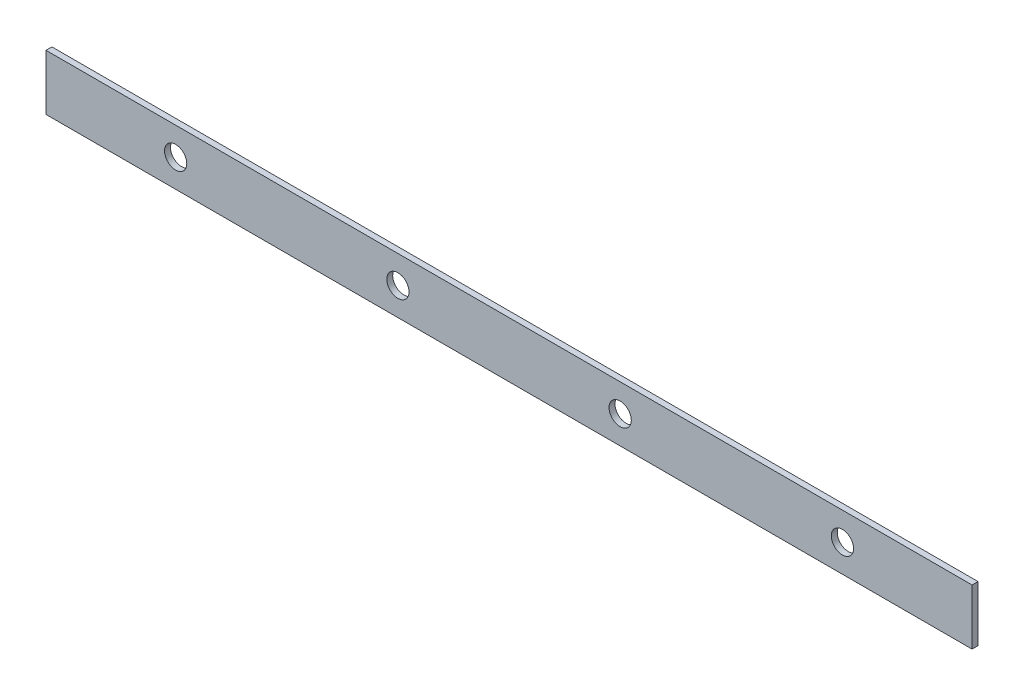
ISO-10303-21;
HEADER;
FILE_DESCRIPTION(('STEP AP214'),'2;1');
FILE_NAME('part.step','',(''),(''),'','','');
FILE_SCHEMA(('AUTOMOTIVE_DESIGN { 1 0 10303 214 1 1 1 1 }'));
ENDSEC;
DATA;
#1=APPLICATION_CONTEXT('core data for automotive mechanical design processes');
#2=APPLICATION_PROTOCOL_DEFINITION('international standard','automotive_design',2000,#1);
#3=PRODUCT_CONTEXT('',#1,'mechanical');
#4=PRODUCT('Part','Part','',(#3));
#5=PRODUCT_RELATED_PRODUCT_CATEGORY('part','',(#4));
#6=PRODUCT_DEFINITION_FORMATION('','',#4);
#7=PRODUCT_DEFINITION_CONTEXT('part definition',#1,'design');
#8=PRODUCT_DEFINITION('design','',#6,#7);
#9=PRODUCT_DEFINITION_SHAPE('','',#8);
#10=(LENGTH_UNIT() NAMED_UNIT(*) SI_UNIT(.MILLI.,.METRE.));
#11=(NAMED_UNIT(*) PLANE_ANGLE_UNIT() SI_UNIT($,.RADIAN.));
#12=(NAMED_UNIT(*) SI_UNIT($,.STERADIAN.) SOLID_ANGLE_UNIT());
#13=UNCERTAINTY_MEASURE_WITH_UNIT(LENGTH_MEASURE(1.E-05),#10,'distance_accuracy_value','');
#14=(GEOMETRIC_REPRESENTATION_CONTEXT(3) GLOBAL_UNCERTAINTY_ASSIGNED_CONTEXT((#13)) GLOBAL_UNIT_ASSIGNED_CONTEXT((#10,
#11,#12)) REPRESENTATION_CONTEXT('',''));
#15=CARTESIAN_POINT('',(0.,0.,0.));
#16=DIRECTION('',(0.,0.,1.));
#17=DIRECTION('',(1.,0.,0.));
#18=AXIS2_PLACEMENT_3D('',#15,#16,#17);
#19=CARTESIAN_POINT('',(0.,15.,-1.6));
#20=DIRECTION('',(-1.,0.,0.));
#21=DIRECTION('',(0.,-1.,0.));
#22=AXIS2_PLACEMENT_3D('',#19,#20,#21);
#23=PLANE('',#22);
#24=DIRECTION('',(0.,-1.,0.));
#25=VECTOR('',#24,1.);
#26=CARTESIAN_POINT('',(0.,15.,0.));
#27=LINE('',#26,#25);
#28=CARTESIAN_POINT('',(0.,15.,0.));
#29=VERTEX_POINT('',#28);
#30=CARTESIAN_POINT('',(0.,0.,0.));
#31=VERTEX_POINT('',#30);
#32=EDGE_CURVE('E102',#29,#31,#27,.T.);
#33=ORIENTED_EDGE('',*,*,#32,.F.);
#34=DIRECTION('',(0.,0.,1.));
#35=VECTOR('',#34,1.);
#36=CARTESIAN_POINT('',(0.,15.,-1.6));
#37=LINE('',#36,#35);
#38=CARTESIAN_POINT('',(0.,15.,-1.6));
#39=VERTEX_POINT('',#38);
#40=EDGE_CURVE('E11',#39,#29,#37,.T.);
#41=ORIENTED_EDGE('',*,*,#40,.F.);
#42=DIRECTION('',(0.,-1.,0.));
#43=VECTOR('',#42,1.);
#44=CARTESIAN_POINT('',(0.,15.,-1.6));
#45=LINE('',#44,#43);
#46=CARTESIAN_POINT('',(0.,0.,-1.6));
#47=VERTEX_POINT('',#46);
#48=EDGE_CURVE('E95',#39,#47,#45,.T.);
#49=ORIENTED_EDGE('',*,*,#48,.T.);
#50=DIRECTION('',(0.,0.,1.));
#51=VECTOR('',#50,1.);
#52=CARTESIAN_POINT('',(0.,0.,-1.6));
#53=LINE('',#52,#51);
#54=EDGE_CURVE('E40',#47,#31,#53,.T.);
#55=ORIENTED_EDGE('',*,*,#54,.T.);
#56=EDGE_LOOP('',(#33,#41,#49,#55));
#57=FACE_BOUND('',#56,.T.);
#58=ADVANCED_FACE('F37',(#57),#23,.T.);
#59=CARTESIAN_POINT('',(250.,15.,-1.6));
#60=DIRECTION('',(0.,1.,0.));
#61=DIRECTION('',(-1.,0.,0.));
#62=AXIS2_PLACEMENT_3D('',#59,#60,#61);
#63=PLANE('',#62);
#64=DIRECTION('',(-1.,0.,0.));
#65=VECTOR('',#64,1.);
#66=CARTESIAN_POINT('',(250.,15.,0.));
#67=LINE('',#66,#65);
#68=CARTESIAN_POINT('',(250.,15.,0.));
#69=VERTEX_POINT('',#68);
#70=EDGE_CURVE('E97',#69,#29,#67,.T.);
#71=ORIENTED_EDGE('',*,*,#70,.F.);
#72=DIRECTION('',(0.,0.,1.));
#73=VECTOR('',#72,1.);
#74=CARTESIAN_POINT('',(250.,15.,-1.6));
#75=LINE('',#74,#73);
#76=CARTESIAN_POINT('',(250.,15.,-1.6));
#77=VERTEX_POINT('',#76);
#78=EDGE_CURVE('E46',#77,#69,#75,.T.);
#79=ORIENTED_EDGE('',*,*,#78,.F.);
#80=DIRECTION('',(-1.,0.,0.));
#81=VECTOR('',#80,1.);
#82=CARTESIAN_POINT('',(250.,15.,-1.6));
#83=LINE('',#82,#81);
#84=EDGE_CURVE('E92',#77,#39,#83,.T.);
#85=ORIENTED_EDGE('',*,*,#84,.T.);
#86=ORIENTED_EDGE('',*,*,#40,.T.);
#87=EDGE_LOOP('',(#71,#79,#85,#86));
#88=FACE_BOUND('',#87,.T.);
#89=ADVANCED_FACE('F113',(#88),#63,.T.);
#90=CARTESIAN_POINT('',(250.,15.,-1.6));
#91=DIRECTION('',(1.,0.,0.));
#92=DIRECTION('',(0.,0.,-1.));
#93=AXIS2_PLACEMENT_3D('',#90,#91,#92);
#94=PLANE('',#93);
#95=DIRECTION('',(0.,1.,0.));
#96=VECTOR('',#95,1.);
#97=CARTESIAN_POINT('',(250.,15.,0.));
#98=LINE('',#97,#96);
#99=CARTESIAN_POINT('',(250.,0.,0.));
#100=VERTEX_POINT('',#99);
#101=EDGE_CURVE('E87',#100,#69,#98,.T.);
#102=ORIENTED_EDGE('',*,*,#101,.F.);
#103=DIRECTION('',(0.,0.,1.));
#104=VECTOR('',#103,1.);
#105=CARTESIAN_POINT('',(250.,0.,-1.6));
#106=LINE('',#105,#104);
#107=CARTESIAN_POINT('',(250.,0.,-1.6));
#108=VERTEX_POINT('',#107);
#109=EDGE_CURVE('E82',#108,#100,#106,.T.);
#110=ORIENTED_EDGE('',*,*,#109,.F.);
#111=DIRECTION('',(0.,1.,0.));
#112=VECTOR('',#111,1.);
#113=CARTESIAN_POINT('',(250.,15.,-1.6));
#114=LINE('',#113,#112);
#115=EDGE_CURVE('E85',#108,#77,#114,.T.);
#116=ORIENTED_EDGE('',*,*,#115,.T.);
#117=ORIENTED_EDGE('',*,*,#78,.T.);
#118=EDGE_LOOP('',(#102,#110,#116,#117));
#119=FACE_BOUND('',#118,.T.);
#120=ADVANCED_FACE('F84',(#119),#94,.T.);
#121=CARTESIAN_POINT('',(0.,0.,-1.6));
#122=DIRECTION('',(0.,-1.,0.));
#123=DIRECTION('',(1.,0.,0.));
#124=AXIS2_PLACEMENT_3D('',#121,#122,#123);
#125=PLANE('',#124);
#126=DIRECTION('',(1.,0.,0.));
#127=VECTOR('',#126,1.);
#128=CARTESIAN_POINT('',(0.,0.,0.));
#129=LINE('',#128,#127);
#130=EDGE_CURVE('E105',#31,#100,#129,.T.);
#131=ORIENTED_EDGE('',*,*,#130,.F.);
#132=ORIENTED_EDGE('',*,*,#54,.F.);
#133=DIRECTION('',(1.,0.,0.));
#134=VECTOR('',#133,1.);
#135=CARTESIAN_POINT('',(0.,0.,-1.6));
#136=LINE('',#135,#134);
#137=EDGE_CURVE('E91',#47,#108,#136,.T.);
#138=ORIENTED_EDGE('',*,*,#137,.T.);
#139=ORIENTED_EDGE('',*,*,#109,.T.);
#140=EDGE_LOOP('',(#131,#132,#138,#139));
#141=FACE_BOUND('',#140,.T.);
#142=ADVANCED_FACE('F94',(#141),#125,.T.);
#143=CARTESIAN_POINT('',(0.,0.,-1.6));
#144=DIRECTION('',(0.,0.,1.));
#145=DIRECTION('',(1.,0.,0.));
#146=AXIS2_PLACEMENT_3D('',#143,#144,#145);
#147=PLANE('',#146);
#148=CARTESIAN_POINT('',(155.,7.50000000000004,-1.6));
#149=DIRECTION('',(0.,0.,1.));
#150=DIRECTION('',(1.,0.,0.));
#151=AXIS2_PLACEMENT_3D('',#148,#149,#150);
#152=CIRCLE('',#151,2.99999999999999);
#153=CARTESIAN_POINT('',(158.,7.50000000000004,-1.6));
#154=VERTEX_POINT('',#153);
#155=EDGE_CURVE('E154',#154,#154,#152,.T.);
#156=ORIENTED_EDGE('',*,*,#155,.T.);
#157=EDGE_LOOP('',(#156));
#158=FACE_BOUND('',#157,.T.);
#159=CARTESIAN_POINT('',(35.,7.50000000000003,-1.6));
#160=DIRECTION('',(0.,0.,1.));
#161=DIRECTION('',(1.,0.,0.));
#162=AXIS2_PLACEMENT_3D('',#159,#160,#161);
#163=CIRCLE('',#162,3.);
#164=CARTESIAN_POINT('',(38.,7.50000000000003,-1.6));
#165=VERTEX_POINT('',#164);
#166=EDGE_CURVE('E162',#165,#165,#163,.T.);
#167=ORIENTED_EDGE('',*,*,#166,.T.);
#168=EDGE_LOOP('',(#167));
#169=FACE_BOUND('',#168,.T.);
#170=CARTESIAN_POINT('',(95.,7.50000000000003,-1.6));
#171=DIRECTION('',(0.,0.,1.));
#172=DIRECTION('',(1.,0.,0.));
#173=AXIS2_PLACEMENT_3D('',#170,#171,#172);
#174=CIRCLE('',#173,3.00000000000001);
#175=CARTESIAN_POINT('',(98.,7.50000000000003,-1.6));
#176=VERTEX_POINT('',#175);
#177=EDGE_CURVE('E168',#176,#176,#174,.T.);
#178=ORIENTED_EDGE('',*,*,#177,.T.);
#179=EDGE_LOOP('',(#178));
#180=FACE_BOUND('',#179,.T.);
#181=CARTESIAN_POINT('',(215.,7.50000000000006,-1.6));
#182=DIRECTION('',(0.,0.,1.));
#183=DIRECTION('',(1.,0.,0.));
#184=AXIS2_PLACEMENT_3D('',#181,#182,#183);
#185=CIRCLE('',#184,2.99999999999999);
#186=CARTESIAN_POINT('',(218.,7.50000000000006,-1.6));
#187=VERTEX_POINT('',#186);
#188=EDGE_CURVE('E106',#187,#187,#185,.T.);
#189=ORIENTED_EDGE('',*,*,#188,.T.);
#190=EDGE_LOOP('',(#189));
#191=FACE_BOUND('',#190,.T.);
#192=ORIENTED_EDGE('',*,*,#48,.F.);
#193=ORIENTED_EDGE('',*,*,#84,.F.);
#194=ORIENTED_EDGE('',*,*,#115,.F.);
#195=ORIENTED_EDGE('',*,*,#137,.F.);
#196=EDGE_LOOP('',(#192,#193,#194,#195));
#197=FACE_BOUND('',#196,.T.);
#198=ADVANCED_FACE('F90',(#158,#169,#180,#191,#197),#147,.F.);
#199=CARTESIAN_POINT('',(0.,0.,0.));
#200=DIRECTION('',(0.,0.,1.));
#201=DIRECTION('',(1.,0.,0.));
#202=AXIS2_PLACEMENT_3D('',#199,#200,#201);
#203=PLANE('',#202);
#204=CARTESIAN_POINT('',(155.,7.50000000000004,0.));
#205=DIRECTION('',(0.,0.,1.));
#206=DIRECTION('',(1.,0.,0.));
#207=AXIS2_PLACEMENT_3D('',#204,#205,#206);
#208=CIRCLE('',#207,2.99999999999999);
#209=CARTESIAN_POINT('',(158.,7.50000000000004,0.));
#210=VERTEX_POINT('',#209);
#211=EDGE_CURVE('E157',#210,#210,#208,.T.);
#212=ORIENTED_EDGE('',*,*,#211,.F.);
#213=EDGE_LOOP('',(#212));
#214=FACE_BOUND('',#213,.T.);
#215=CARTESIAN_POINT('',(35.,7.50000000000003,0.));
#216=DIRECTION('',(0.,0.,1.));
#217=DIRECTION('',(1.,0.,0.));
#218=AXIS2_PLACEMENT_3D('',#215,#216,#217);
#219=CIRCLE('',#218,3.);
#220=CARTESIAN_POINT('',(38.,7.50000000000003,0.));
#221=VERTEX_POINT('',#220);
#222=EDGE_CURVE('E159',#221,#221,#219,.T.);
#223=ORIENTED_EDGE('',*,*,#222,.F.);
#224=EDGE_LOOP('',(#223));
#225=FACE_BOUND('',#224,.T.);
#226=CARTESIAN_POINT('',(95.,7.50000000000003,0.));
#227=DIRECTION('',(0.,0.,1.));
#228=DIRECTION('',(1.,0.,0.));
#229=AXIS2_PLACEMENT_3D('',#226,#227,#228);
#230=CIRCLE('',#229,3.00000000000001);
#231=CARTESIAN_POINT('',(98.,7.50000000000003,0.));
#232=VERTEX_POINT('',#231);
#233=EDGE_CURVE('E165',#232,#232,#230,.T.);
#234=ORIENTED_EDGE('',*,*,#233,.F.);
#235=EDGE_LOOP('',(#234));
#236=FACE_BOUND('',#235,.T.);
#237=CARTESIAN_POINT('',(215.,7.50000000000006,0.));
#238=DIRECTION('',(0.,0.,1.));
#239=DIRECTION('',(1.,0.,0.));
#240=AXIS2_PLACEMENT_3D('',#237,#238,#239);
#241=CIRCLE('',#240,2.99999999999999);
#242=CARTESIAN_POINT('',(218.,7.50000000000006,0.));
#243=VERTEX_POINT('',#242);
#244=EDGE_CURVE('E171',#243,#243,#241,.T.);
#245=ORIENTED_EDGE('',*,*,#244,.F.);
#246=EDGE_LOOP('',(#245));
#247=FACE_BOUND('',#246,.T.);
#248=ORIENTED_EDGE('',*,*,#32,.T.);
#249=ORIENTED_EDGE('',*,*,#130,.T.);
#250=ORIENTED_EDGE('',*,*,#101,.T.);
#251=ORIENTED_EDGE('',*,*,#70,.T.);
#252=EDGE_LOOP('',(#248,#249,#250,#251));
#253=FACE_BOUND('',#252,.T.);
#254=ADVANCED_FACE('F112',(#214,#225,#236,#247,#253),#203,.T.);
#255=CARTESIAN_POINT('',(215.,7.50000000000006,-1.6));
#256=DIRECTION('',(0.,0.,1.));
#257=DIRECTION('',(1.,0.,0.));
#258=AXIS2_PLACEMENT_3D('',#255,#256,#257);
#259=CYLINDRICAL_SURFACE('',#258,2.99999999999999);
#260=ORIENTED_EDGE('',*,*,#188,.F.);
#261=EDGE_LOOP('',(#260));
#262=FACE_BOUND('',#261,.T.);
#263=ORIENTED_EDGE('',*,*,#244,.T.);
#264=EDGE_LOOP('',(#263));
#265=FACE_BOUND('',#264,.T.);
#266=ADVANCED_FACE('F131',(#262,#265),#259,.F.);
#267=CARTESIAN_POINT('',(95.,7.50000000000003,-1.6));
#268=DIRECTION('',(0.,0.,1.));
#269=DIRECTION('',(1.,0.,0.));
#270=AXIS2_PLACEMENT_3D('',#267,#268,#269);
#271=CYLINDRICAL_SURFACE('',#270,3.00000000000001);
#272=ORIENTED_EDGE('',*,*,#177,.F.);
#273=EDGE_LOOP('',(#272));
#274=FACE_BOUND('',#273,.T.);
#275=ORIENTED_EDGE('',*,*,#233,.T.);
#276=EDGE_LOOP('',(#275));
#277=FACE_BOUND('',#276,.T.);
#278=ADVANCED_FACE('F138',(#274,#277),#271,.F.);
#279=CARTESIAN_POINT('',(35.,7.50000000000003,-1.6));
#280=DIRECTION('',(0.,0.,1.));
#281=DIRECTION('',(1.,0.,0.));
#282=AXIS2_PLACEMENT_3D('',#279,#280,#281);
#283=CYLINDRICAL_SURFACE('',#282,3.);
#284=ORIENTED_EDGE('',*,*,#166,.F.);
#285=EDGE_LOOP('',(#284));
#286=FACE_BOUND('',#285,.T.);
#287=ORIENTED_EDGE('',*,*,#222,.T.);
#288=EDGE_LOOP('',(#287));
#289=FACE_BOUND('',#288,.T.);
#290=ADVANCED_FACE('F142',(#286,#289),#283,.F.);
#291=CARTESIAN_POINT('',(155.,7.50000000000004,-1.6));
#292=DIRECTION('',(0.,0.,1.));
#293=DIRECTION('',(1.,0.,0.));
#294=AXIS2_PLACEMENT_3D('',#291,#292,#293);
#295=CYLINDRICAL_SURFACE('',#294,2.99999999999999);
#296=ORIENTED_EDGE('',*,*,#155,.F.);
#297=EDGE_LOOP('',(#296));
#298=FACE_BOUND('',#297,.T.);
#299=ORIENTED_EDGE('',*,*,#211,.T.);
#300=EDGE_LOOP('',(#299));
#301=FACE_BOUND('',#300,.T.);
#302=ADVANCED_FACE('F146',(#298,#301),#295,.F.);
#303=CLOSED_SHELL('',(#58,#89,#120,#142,#198,#254,#266,#278,#290,#302));
#304=MANIFOLD_SOLID_BREP('B2',#303);
#305=ADVANCED_BREP_SHAPE_REPRESENTATION('',(#18,#304),#14);
#306=SHAPE_DEFINITION_REPRESENTATION(#9,#305);
ENDSEC;
END-ISO-10303-21;
